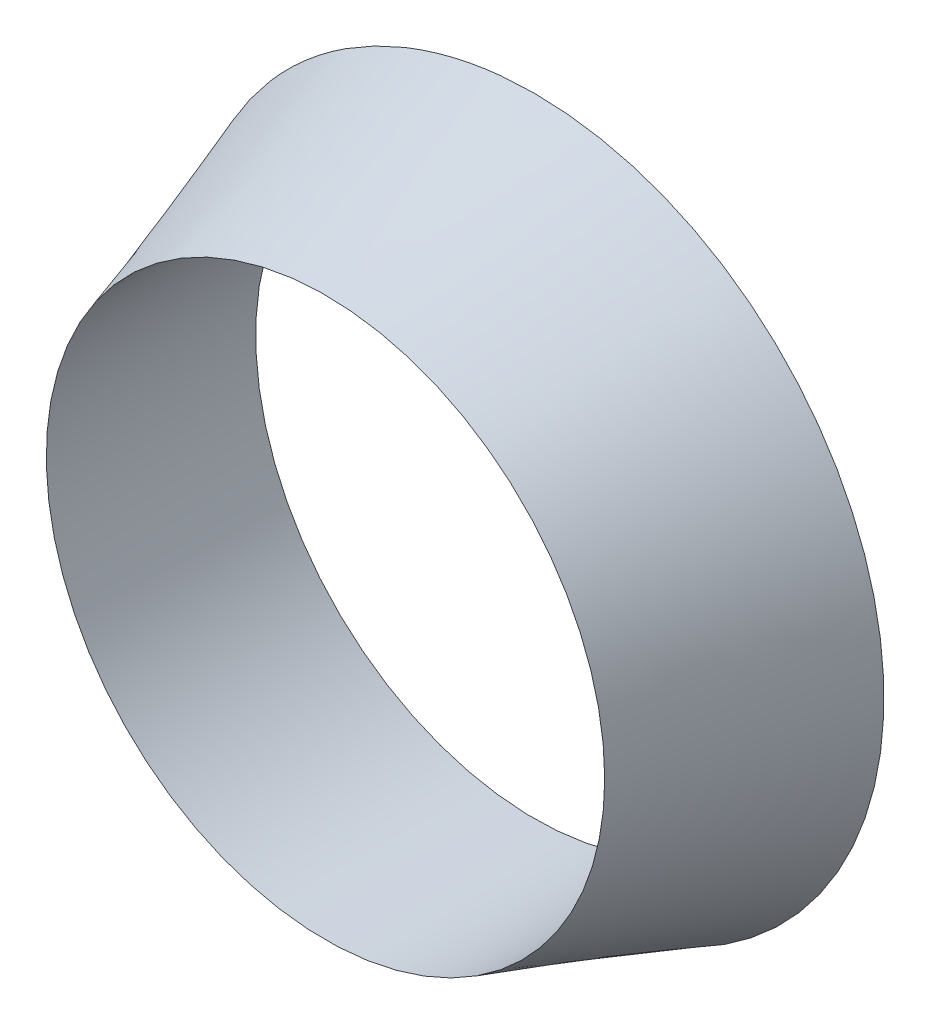
ISO-10303-21;
HEADER;
FILE_DESCRIPTION(('STEP AP214'),'2;1');
FILE_NAME('part.step','',(''),(''),'','','');
FILE_SCHEMA(('AUTOMOTIVE_DESIGN { 1 0 10303 214 1 1 1 1 }'));
ENDSEC;
DATA;
#1=APPLICATION_CONTEXT('core data for automotive mechanical design processes');
#2=APPLICATION_PROTOCOL_DEFINITION('international standard','automotive_design',2000,#1);
#3=PRODUCT_CONTEXT('',#1,'mechanical');
#4=PRODUCT('Part','Part','',(#3));
#5=PRODUCT_RELATED_PRODUCT_CATEGORY('part','',(#4));
#6=PRODUCT_DEFINITION_FORMATION('','',#4);
#7=PRODUCT_DEFINITION_CONTEXT('part definition',#1,'design');
#8=PRODUCT_DEFINITION('design','',#6,#7);
#9=PRODUCT_DEFINITION_SHAPE('','',#8);
#10=(LENGTH_UNIT() NAMED_UNIT(*) SI_UNIT(.MILLI.,.METRE.));
#11=(NAMED_UNIT(*) PLANE_ANGLE_UNIT() SI_UNIT($,.RADIAN.));
#12=(NAMED_UNIT(*) SI_UNIT($,.STERADIAN.) SOLID_ANGLE_UNIT());
#13=UNCERTAINTY_MEASURE_WITH_UNIT(LENGTH_MEASURE(1.E-05),#10,'distance_accuracy_value','');
#14=(GEOMETRIC_REPRESENTATION_CONTEXT(3) GLOBAL_UNCERTAINTY_ASSIGNED_CONTEXT((#13)) GLOBAL_UNIT_ASSIGNED_CONTEXT((#10,
#11,#12)) REPRESENTATION_CONTEXT('',''));
#15=CARTESIAN_POINT('',(0.,0.,0.));
#16=DIRECTION('',(0.,0.,1.));
#17=DIRECTION('',(1.,0.,0.));
#18=AXIS2_PLACEMENT_3D('',#15,#16,#17);
#19=CARTESIAN_POINT('',(0.,0.,-3.));
#20=DIRECTION('',(0.,0.,1.));
#21=DIRECTION('',(1.,0.,0.));
#22=AXIS2_PLACEMENT_3D('',#19,#20,#21);
#23=PLANE('',#22);
#24=CARTESIAN_POINT('',(0.,0.,-3.));
#25=DIRECTION('',(0.,0.,1.));
#26=DIRECTION('',(1.,0.,0.));
#27=AXIS2_PLACEMENT_3D('',#24,#25,#26);
#28=CIRCLE('',#27,4.);
#29=CARTESIAN_POINT('',(4.,0.,-3.));
#30=VERTEX_POINT('',#29);
#31=EDGE_CURVE('E45',#30,#30,#28,.T.);
#32=ORIENTED_EDGE('',*,*,#31,.T.);
#33=EDGE_LOOP('',(#32));
#34=FACE_BOUND('',#33,.T.);
#35=CARTESIAN_POINT('',(0.,0.,-3.));
#36=DIRECTION('',(0.,0.,1.));
#37=DIRECTION('',(1.,0.,0.));
#38=AXIS2_PLACEMENT_3D('',#35,#36,#37);
#39=CIRCLE('',#38,5.);
#40=CARTESIAN_POINT('',(2.30068901227971,-4.43923755489334,-3.));
#41=VERTEX_POINT('',#40);
#42=EDGE_CURVE('E11',#41,#41,#39,.T.);
#43=ORIENTED_EDGE('',*,*,#42,.F.);
#44=EDGE_LOOP('',(#43));
#45=FACE_BOUND('',#44,.T.);
#46=ADVANCED_FACE('F37',(#34,#45),#23,.F.);
#47=CARTESIAN_POINT('',(2.5107654451628,-3.11384920626809,0.));
#48=CARTESIAN_POINT('',(2.30068901227971,-4.43923755489334,-3.));
#49=CARTESIAN_POINT('',(-3.71693296737338,-8.1353800965937,0.));
#50=CARTESIAN_POINT('',(-6.57778609750697,-9.04061557945276,-3.));
#51=CARTESIAN_POINT('',(-8.73846385769899,-1.90768168405751,0.));
#52=CARTESIAN_POINT('',(-11.1791641220664,-0.162140469666082,-3.));
#53=CARTESIAN_POINT('',(-2.5107654451628,3.11384920626809,0.));
#54=CARTESIAN_POINT('',(-2.30068901227971,4.43923755489334,-3.));
#55=CARTESIAN_POINT('',(3.71693296737338,8.1353800965937,0.));
#56=CARTESIAN_POINT('',(6.57778609750698,9.04061557945277,-3.));
#57=CARTESIAN_POINT('',(8.73846385769899,1.90768168405751,0.));
#58=CARTESIAN_POINT('',(11.1791641220664,0.162140469666076,-3.));
#59=CARTESIAN_POINT('',(2.5107654451628,-3.11384920626809,0.));
#60=CARTESIAN_POINT('',(2.30068901227971,-4.43923755489334,-3.));
#61=(BOUNDED_SURFACE() B_SPLINE_SURFACE(3,1,((#47,#48),(#49,#50),(#51,#52),(#53,#54),(#55,#56),
(#57,#58),(#59,#60)),.UNSPECIFIED.,.T.,.F.,.F.) B_SPLINE_SURFACE_WITH_KNOTS((4,3,4),(2,2),(0.,
0.5,1.),(0.,1.),.UNSPECIFIED.) GEOMETRIC_REPRESENTATION_ITEM() RATIONAL_B_SPLINE_SURFACE(((1.,
1.),(0.333333333333333,0.333333333333333),(0.333333333333333,0.333333333333333),(1.,1.),
(0.333333333333333,0.333333333333333),(0.333333333333333,0.333333333333333),(1.,1.))) REPRESENTATION_ITEM('') SURFACE());
#62=CARTESIAN_POINT('',(0.,0.,0.));
#63=DIRECTION('',(0.,0.,1.));
#64=DIRECTION('',(1.,0.,0.));
#65=AXIS2_PLACEMENT_3D('',#62,#63,#64);
#66=CIRCLE('',#65,4.);
#67=CARTESIAN_POINT('',(2.5107654451628,-3.11384920626809,0.));
#68=VERTEX_POINT('',#67);
#69=EDGE_CURVE('E51',#68,#68,#66,.T.);
#70=CARTESIAN_POINT('',(2.5107654451628,-3.11384920626809,0.));
#71=CARTESIAN_POINT('',(2.50857714898694,-3.12765533489961,-0.0312499999999999));
#72=CARTESIAN_POINT('',(2.50638885281107,-3.14146146353112,-0.0624999999999999));
#73=CARTESIAN_POINT('',(2.50201226045934,-3.16907372079414,-0.125));
#74=CARTESIAN_POINT('',(2.49982396428348,-3.18287984942566,-0.15625));
#75=CARTESIAN_POINT('',(2.49544737193174,-3.21049210668868,-0.21875));
#76=CARTESIAN_POINT('',(2.49325907575588,-3.2242982353202,-0.25));
#77=CARTESIAN_POINT('',(2.48888248340415,-3.25191049258322,-0.3125));
#78=CARTESIAN_POINT('',(2.48669418722828,-3.26571662121474,-0.34375));
#79=CARTESIAN_POINT('',(2.48231759487655,-3.29332887847776,-0.40625));
#80=CARTESIAN_POINT('',(2.48012929870068,-3.30713500710928,-0.4375));
#81=CARTESIAN_POINT('',(2.47575270634895,-3.3347472643723,-0.5));
#82=CARTESIAN_POINT('',(2.47356441017309,-3.34855339300381,-0.53125));
#83=CARTESIAN_POINT('',(2.46918781782136,-3.37616565026684,-0.59375));
#84=CARTESIAN_POINT('',(2.46699952164549,-3.38997177889835,-0.625));
#85=CARTESIAN_POINT('',(2.46262292929376,-3.41758403616138,-0.6875));
#86=CARTESIAN_POINT('',(2.4604346331179,-3.43139016479289,-0.71875));
#87=CARTESIAN_POINT('',(2.45605804076616,-3.45900242205592,-0.78125));
#88=CARTESIAN_POINT('',(2.4538697445903,-3.47280855068743,-0.8125));
#89=CARTESIAN_POINT('',(2.44949315223857,-3.50042080795046,-0.875));
#90=CARTESIAN_POINT('',(2.4473048560627,-3.51422693658197,-0.90625));
#91=CARTESIAN_POINT('',(2.44292826371097,-3.541839193845,-0.96875));
#92=CARTESIAN_POINT('',(2.44073996753511,-3.55564532247651,-1.));
#93=CARTESIAN_POINT('',(2.43636337518337,-3.58325757973953,-1.0625));
#94=CARTESIAN_POINT('',(2.43417507900751,-3.59706370837105,-1.09375));
#95=CARTESIAN_POINT('',(2.42979848665578,-3.62467596563407,-1.15625));
#96=CARTESIAN_POINT('',(2.42761019047991,-3.63848209426559,-1.1875));
#97=CARTESIAN_POINT('',(2.42323359812818,-3.66609435152861,-1.25));
#98=CARTESIAN_POINT('',(2.42104530195232,-3.67990048016013,-1.28125));
#99=CARTESIAN_POINT('',(2.41666870960058,-3.70751273742315,-1.34375));
#100=CARTESIAN_POINT('',(2.41448041342472,-3.72131886605467,-1.375));
#101=CARTESIAN_POINT('',(2.41010382107299,-3.74893112331769,-1.4375));
#102=CARTESIAN_POINT('',(2.40791552489712,-3.7627372519492,-1.46875));
#103=CARTESIAN_POINT('',(2.40353893254539,-3.79034950921223,-1.53125));
#104=CARTESIAN_POINT('',(2.40135063636953,-3.80415563784374,-1.5625));
#105=CARTESIAN_POINT('',(2.39697404401779,-3.83176789510677,-1.625));
#106=CARTESIAN_POINT('',(2.39478574784193,-3.84557402373828,-1.65625));
#107=CARTESIAN_POINT('',(2.3904091554902,-3.87318628100131,-1.71875));
#108=CARTESIAN_POINT('',(2.38822085931433,-3.88699240963282,-1.75));
#109=CARTESIAN_POINT('',(2.3838442669626,-3.91460466689585,-1.8125));
#110=CARTESIAN_POINT('',(2.38165597078674,-3.92841079552736,-1.84375));
#111=CARTESIAN_POINT('',(2.377279378435,-3.95602305279039,-1.90625));
#112=CARTESIAN_POINT('',(2.37509108225914,-3.9698291814219,-1.9375));
#113=CARTESIAN_POINT('',(2.37071448990741,-3.99744143868493,-2.));
#114=CARTESIAN_POINT('',(2.36852619373154,-4.01124756731644,-2.03125));
#115=CARTESIAN_POINT('',(2.36414960137981,-4.03885982457946,-2.09375));
#116=CARTESIAN_POINT('',(2.36196130520395,-4.05266595321098,-2.125));
#117=CARTESIAN_POINT('',(2.35758471285222,-4.080278210474,-2.1875));
#118=CARTESIAN_POINT('',(2.35539641667635,-4.09408433910552,-2.21875));
#119=CARTESIAN_POINT('',(2.35101982432462,-4.12169659636854,-2.28125));
#120=CARTESIAN_POINT('',(2.34883152814875,-4.13550272500005,-2.3125));
#121=CARTESIAN_POINT('',(2.34445493579702,-4.16311498226308,-2.375));
#122=CARTESIAN_POINT('',(2.34226663962116,-4.17692111089459,-2.40625));
#123=CARTESIAN_POINT('',(2.33789004726943,-4.20453336815762,-2.46875));
#124=CARTESIAN_POINT('',(2.33570175109356,-4.21833949678913,-2.5));
#125=CARTESIAN_POINT('',(2.33132515874183,-4.24595175405216,-2.5625));
#126=CARTESIAN_POINT('',(2.32913686256596,-4.25975788268367,-2.59375));
#127=CARTESIAN_POINT('',(2.32476027021423,-4.2873701399467,-2.65625));
#128=CARTESIAN_POINT('',(2.32257197403837,-4.30117626857821,-2.6875));
#129=CARTESIAN_POINT('',(2.31819538168664,-4.32878852584124,-2.75));
#130=CARTESIAN_POINT('',(2.31600708551077,-4.34259465447275,-2.78125));
#131=CARTESIAN_POINT('',(2.31163049315904,-4.37020691173578,-2.84375));
#132=CARTESIAN_POINT('',(2.30944219698317,-4.38401304036729,-2.875));
#133=CARTESIAN_POINT('',(2.30506560463144,-4.41162529763031,-2.9375));
#134=CARTESIAN_POINT('',(2.30287730845558,-4.42543142626183,-2.96875));
#135=CARTESIAN_POINT('',(2.30068901227971,-4.43923755489334,-3.));
#136=B_SPLINE_CURVE_WITH_KNOTS('',3,(#70,#71,#72,#73,#74,#75,#76,#77,#78,#79,#80,#81,#82,#83,
#84,#85,#86,#87,#88,#89,#90,#91,#92,#93,#94,#95,#96,#97,#98,#99,#100,#101,#102,#103,#104,#105,
#106,#107,#108,#109,#110,#111,#112,#113,#114,#115,#116,#117,#118,#119,#120,#121,#122,#123,#124,
#125,#126,#127,#128,#129,#130,#131,#132,#133,#134,#135),.UNSPECIFIED.,.F.,.F.,(4,2,2,2,2,2,2,2,
2,2,2,2,2,2,2,2,2,2,2,2,2,2,2,2,2,2,2,2,2,2,2,2,4),(0.,0.102701718347303,0.205403436694606,
0.308105155041909,0.410806873389211,0.513508591736514,0.616210310083817,0.71891202843112,
0.821613746778422,0.924315465125725,1.02701718347303,1.12971890182033,1.23242062016763,
1.33512233851494,1.43782405686224,1.54052577520954,1.64322749355684,1.74592921190415,
1.84863093025145,1.95133264859875,2.05403436694606,2.15673608529336,2.25943780364066,
2.36213952198796,2.46484124033527,2.56754295868257,2.67024467702987,2.77294639537718,
2.87564811372448,2.97834983207178,3.08105155041908,3.18375326876639,3.28645498711369),.UNSPECIFIED.);
#137=EDGE_CURVE('BSEAM75',#68,#41,#136,.T.);
#138=ORIENTED_EDGE('',*,*,#69,.F.);
#139=ORIENTED_EDGE('',*,*,#42,.T.);
#140=ORIENTED_EDGE('',*,*,#137,.T.);
#141=ORIENTED_EDGE('',*,*,#137,.F.);
#142=EDGE_LOOP('',(#138,#140,#139,#141));
#143=FACE_BOUND('',#142,.T.);
#144=ADVANCED_FACE('F75',(#143),#61,.T.);
#145=CARTESIAN_POINT('',(0.,0.,-10.));
#146=DIRECTION('',(0.,0.,1.));
#147=DIRECTION('',(1.,0.,0.));
#148=AXIS2_PLACEMENT_3D('',#145,#146,#147);
#149=CYLINDRICAL_SURFACE('',#148,4.);
#150=ORIENTED_EDGE('',*,*,#69,.T.);
#151=EDGE_LOOP('',(#150));
#152=FACE_BOUND('',#151,.T.);
#153=ORIENTED_EDGE('',*,*,#31,.F.);
#154=EDGE_LOOP('',(#153));
#155=FACE_BOUND('',#154,.T.);
#156=ADVANCED_FACE('F67',(#152,#155),#149,.F.);
#157=CLOSED_SHELL('',(#46,#144,#156));
#158=MANIFOLD_SOLID_BREP('B2',#157);
#159=ADVANCED_BREP_SHAPE_REPRESENTATION('',(#18,#158),#14);
#160=SHAPE_DEFINITION_REPRESENTATION(#9,#159);
ENDSEC;
END-ISO-10303-21;
